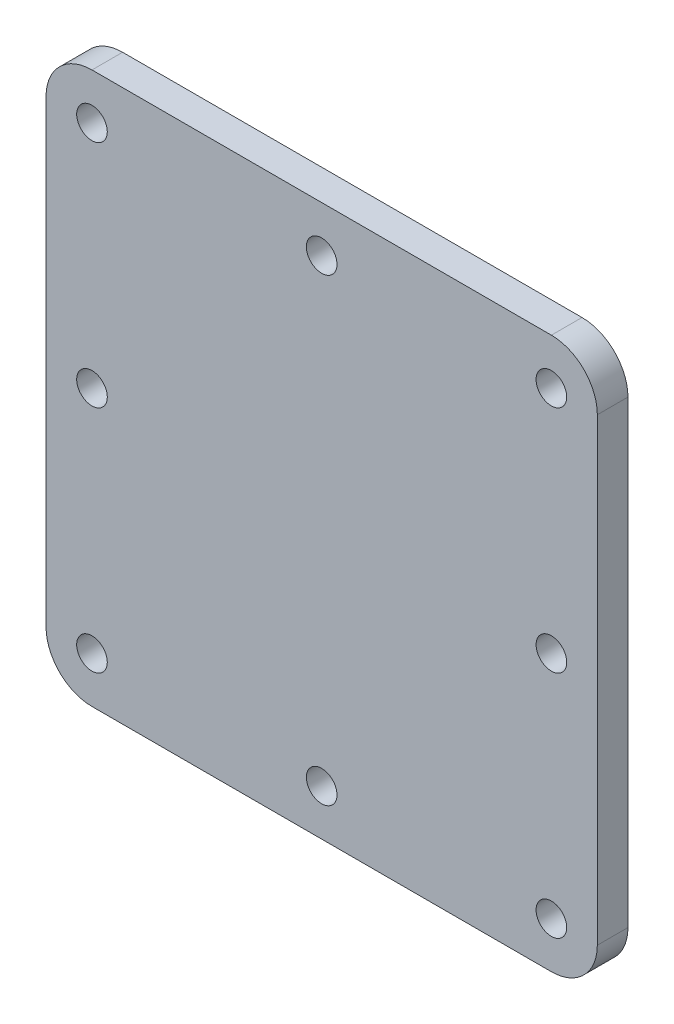
ISO-10303-21;
HEADER;
FILE_DESCRIPTION(('STEP AP214'),'2;1');
FILE_NAME('part.step','',(''),(''),'','','');
FILE_SCHEMA(('AUTOMOTIVE_DESIGN { 1 0 10303 214 1 1 1 1 }'));
ENDSEC;
DATA;
#1=APPLICATION_CONTEXT('core data for automotive mechanical design processes');
#2=APPLICATION_PROTOCOL_DEFINITION('international standard','automotive_design',2000,#1);
#3=PRODUCT_CONTEXT('',#1,'mechanical');
#4=PRODUCT('Part','Part','',(#3));
#5=PRODUCT_RELATED_PRODUCT_CATEGORY('part','',(#4));
#6=PRODUCT_DEFINITION_FORMATION('','',#4);
#7=PRODUCT_DEFINITION_CONTEXT('part definition',#1,'design');
#8=PRODUCT_DEFINITION('design','',#6,#7);
#9=PRODUCT_DEFINITION_SHAPE('','',#8);
#10=(LENGTH_UNIT() NAMED_UNIT(*) SI_UNIT(.MILLI.,.METRE.));
#11=(NAMED_UNIT(*) PLANE_ANGLE_UNIT() SI_UNIT($,.RADIAN.));
#12=(NAMED_UNIT(*) SI_UNIT($,.STERADIAN.) SOLID_ANGLE_UNIT());
#13=UNCERTAINTY_MEASURE_WITH_UNIT(LENGTH_MEASURE(1.E-05),#10,'distance_accuracy_value','');
#14=(GEOMETRIC_REPRESENTATION_CONTEXT(3) GLOBAL_UNCERTAINTY_ASSIGNED_CONTEXT((#13)) GLOBAL_UNIT_ASSIGNED_CONTEXT((#10,
#11,#12)) REPRESENTATION_CONTEXT('',''));
#15=CARTESIAN_POINT('',(0.,0.,0.));
#16=DIRECTION('',(0.,0.,1.));
#17=DIRECTION('',(1.,0.,0.));
#18=AXIS2_PLACEMENT_3D('',#15,#16,#17);
#19=CARTESIAN_POINT('',(-75.,-75.,10.));
#20=DIRECTION('',(0.,0.,1.));
#21=DIRECTION('',(1.,0.,0.));
#22=AXIS2_PLACEMENT_3D('',#19,#20,#21);
#23=PLANE('',#22);
#24=CARTESIAN_POINT('',(1.54341102686378E-12,-75.,10.));
#25=DIRECTION('',(0.,0.,1.));
#26=DIRECTION('',(1.,0.,0.));
#27=AXIS2_PLACEMENT_3D('',#24,#25,#26);
#28=CIRCLE('',#27,5.);
#29=CARTESIAN_POINT('',(5.00000000000154,-75.,10.));
#30=VERTEX_POINT('',#29);
#31=EDGE_CURVE('E212',#30,#30,#28,.T.);
#32=ORIENTED_EDGE('',*,*,#31,.F.);
#33=EDGE_LOOP('',(#32));
#34=FACE_BOUND('',#33,.T.);
#35=CARTESIAN_POINT('',(75.0000000000008,0.,10.));
#36=DIRECTION('',(0.,0.,1.));
#37=DIRECTION('',(1.,0.,0.));
#38=AXIS2_PLACEMENT_3D('',#35,#36,#37);
#39=CIRCLE('',#38,5.);
#40=CARTESIAN_POINT('',(80.0000000000008,0.,10.));
#41=VERTEX_POINT('',#40);
#42=EDGE_CURVE('E200',#41,#41,#39,.T.);
#43=ORIENTED_EDGE('',*,*,#42,.F.);
#44=EDGE_LOOP('',(#43));
#45=FACE_BOUND('',#44,.T.);
#46=CARTESIAN_POINT('',(75.,75.,10.));
#47=DIRECTION('',(0.,0.,1.));
#48=DIRECTION('',(1.,0.,0.));
#49=AXIS2_PLACEMENT_3D('',#46,#47,#48);
#50=CIRCLE('',#49,5.00000000000001);
#51=CARTESIAN_POINT('',(80.,75.,10.));
#52=VERTEX_POINT('',#51);
#53=EDGE_CURVE('E188',#52,#52,#50,.T.);
#54=ORIENTED_EDGE('',*,*,#53,.F.);
#55=EDGE_LOOP('',(#54));
#56=FACE_BOUND('',#55,.T.);
#57=CARTESIAN_POINT('',(-75.,75.,10.));
#58=DIRECTION('',(0.,0.,1.));
#59=DIRECTION('',(1.,0.,0.));
#60=AXIS2_PLACEMENT_3D('',#57,#58,#59);
#61=CIRCLE('',#60,5.00000000000001);
#62=CARTESIAN_POINT('',(-70.,75.,10.));
#63=VERTEX_POINT('',#62);
#64=EDGE_CURVE('E134',#63,#63,#61,.T.);
#65=ORIENTED_EDGE('',*,*,#64,.F.);
#66=EDGE_LOOP('',(#65));
#67=FACE_BOUND('',#66,.T.);
#68=CARTESIAN_POINT('',(-75.,-75.,10.));
#69=DIRECTION('',(0.,0.,1.));
#70=DIRECTION('',(1.,0.,0.));
#71=AXIS2_PLACEMENT_3D('',#68,#69,#70);
#72=CIRCLE('',#71,15.);
#73=CARTESIAN_POINT('',(-90.,-74.9999999999999,10.));
#74=VERTEX_POINT('',#73);
#75=CARTESIAN_POINT('',(-74.9999999999999,-90.,10.));
#76=VERTEX_POINT('',#75);
#77=EDGE_CURVE('E145',#74,#76,#72,.T.);
#78=ORIENTED_EDGE('',*,*,#77,.T.);
#79=DIRECTION('',(1.,0.,0.));
#80=VECTOR('',#79,1.);
#81=CARTESIAN_POINT('',(-74.9999999999999,-90.,10.));
#82=LINE('',#81,#80);
#83=CARTESIAN_POINT('',(75.,-89.9999999999992,10.));
#84=VERTEX_POINT('',#83);
#85=EDGE_CURVE('E93',#76,#84,#82,.T.);
#86=ORIENTED_EDGE('',*,*,#85,.T.);
#87=CARTESIAN_POINT('',(75.,-74.9999999999992,10.));
#88=DIRECTION('',(0.,0.,1.));
#89=DIRECTION('',(1.,0.,0.));
#90=AXIS2_PLACEMENT_3D('',#87,#88,#89);
#91=CIRCLE('',#90,15.);
#92=CARTESIAN_POINT('',(90.,-75.,10.));
#93=VERTEX_POINT('',#92);
#94=EDGE_CURVE('E160',#84,#93,#91,.T.);
#95=ORIENTED_EDGE('',*,*,#94,.T.);
#96=DIRECTION('',(0.,1.,0.));
#97=VECTOR('',#96,1.);
#98=CARTESIAN_POINT('',(90.,75.0000000000019,10.));
#99=LINE('',#98,#97);
#100=CARTESIAN_POINT('',(90.,75.0000000000019,10.));
#101=VERTEX_POINT('',#100);
#102=EDGE_CURVE('E173',#93,#101,#99,.T.);
#103=ORIENTED_EDGE('',*,*,#102,.T.);
#104=CARTESIAN_POINT('',(75.,75.,10.));
#105=DIRECTION('',(0.,0.,1.));
#106=DIRECTION('',(-1.,0.,0.));
#107=AXIS2_PLACEMENT_3D('',#104,#105,#106);
#108=CIRCLE('',#107,15.);
#109=CARTESIAN_POINT('',(74.9999999999999,90.,10.));
#110=VERTEX_POINT('',#109);
#111=EDGE_CURVE('E112',#101,#110,#108,.T.);
#112=ORIENTED_EDGE('',*,*,#111,.T.);
#113=DIRECTION('',(-1.,0.,0.));
#114=VECTOR('',#113,1.);
#115=CARTESIAN_POINT('',(-74.9999999999999,90.,10.));
#116=LINE('',#115,#114);
#117=CARTESIAN_POINT('',(-74.9999999999999,90.,10.));
#118=VERTEX_POINT('',#117);
#119=EDGE_CURVE('E106',#110,#118,#116,.T.);
#120=ORIENTED_EDGE('',*,*,#119,.T.);
#121=CARTESIAN_POINT('',(-75.,75.,10.));
#122=DIRECTION('',(0.,0.,1.));
#123=DIRECTION('',(1.,0.,0.));
#124=AXIS2_PLACEMENT_3D('',#121,#122,#123);
#125=CIRCLE('',#124,15.);
#126=CARTESIAN_POINT('',(-90.,74.9999999999999,10.));
#127=VERTEX_POINT('',#126);
#128=EDGE_CURVE('E110',#118,#127,#125,.T.);
#129=ORIENTED_EDGE('',*,*,#128,.T.);
#130=DIRECTION('',(0.,-1.,0.));
#131=VECTOR('',#130,1.);
#132=CARTESIAN_POINT('',(-90.,74.9999999999999,10.));
#133=LINE('',#132,#131);
#134=EDGE_CURVE('E50',#127,#74,#133,.T.);
#135=ORIENTED_EDGE('',*,*,#134,.T.);
#136=EDGE_LOOP('',(#78,#86,#95,#103,#112,#120,#129,#135));
#137=FACE_BOUND('',#136,.T.);
#138=CARTESIAN_POINT('',(0.,75.,10.));
#139=DIRECTION('',(0.,0.,1.));
#140=DIRECTION('',(1.,0.,0.));
#141=AXIS2_PLACEMENT_3D('',#138,#139,#140);
#142=CIRCLE('',#141,5.);
#143=CARTESIAN_POINT('',(4.99999999999997,75.,10.));
#144=VERTEX_POINT('',#143);
#145=EDGE_CURVE('E182',#144,#144,#142,.T.);
#146=ORIENTED_EDGE('',*,*,#145,.F.);
#147=EDGE_LOOP('',(#146));
#148=FACE_BOUND('',#147,.T.);
#149=CARTESIAN_POINT('',(-74.9999999999992,0.,10.));
#150=DIRECTION('',(0.,0.,1.));
#151=DIRECTION('',(1.,0.,0.));
#152=AXIS2_PLACEMENT_3D('',#149,#150,#151);
#153=CIRCLE('',#152,5.);
#154=CARTESIAN_POINT('',(-69.9999999999992,0.,10.));
#155=VERTEX_POINT('',#154);
#156=EDGE_CURVE('E194',#155,#155,#153,.T.);
#157=ORIENTED_EDGE('',*,*,#156,.F.);
#158=EDGE_LOOP('',(#157));
#159=FACE_BOUND('',#158,.T.);
#160=CARTESIAN_POINT('',(-74.9999999999985,-75.,10.));
#161=DIRECTION('',(0.,0.,1.));
#162=DIRECTION('',(1.,0.,0.));
#163=AXIS2_PLACEMENT_3D('',#160,#161,#162);
#164=CIRCLE('',#163,5.00000000000001);
#165=CARTESIAN_POINT('',(-69.9999999999985,-75.,10.));
#166=VERTEX_POINT('',#165);
#167=EDGE_CURVE('E206',#166,#166,#164,.T.);
#168=ORIENTED_EDGE('',*,*,#167,.F.);
#169=EDGE_LOOP('',(#168));
#170=FACE_BOUND('',#169,.T.);
#171=CARTESIAN_POINT('',(75.0000000000015,-75.,10.));
#172=DIRECTION('',(0.,0.,1.));
#173=DIRECTION('',(1.,0.,0.));
#174=AXIS2_PLACEMENT_3D('',#171,#172,#173);
#175=CIRCLE('',#174,5.00000000000001);
#176=CARTESIAN_POINT('',(80.0000000000015,-75.,10.));
#177=VERTEX_POINT('',#176);
#178=EDGE_CURVE('E218',#177,#177,#175,.T.);
#179=ORIENTED_EDGE('',*,*,#178,.F.);
#180=EDGE_LOOP('',(#179));
#181=FACE_BOUND('',#180,.T.);
#182=ADVANCED_FACE('F33',(#34,#45,#56,#67,#137,#148,#159,#170,#181),#23,.T.);
#183=CARTESIAN_POINT('',(-75.,-75.,0.));
#184=DIRECTION('',(0.,0.,1.));
#185=DIRECTION('',(1.,0.,0.));
#186=AXIS2_PLACEMENT_3D('',#183,#184,#185);
#187=PLANE('',#186);
#188=CARTESIAN_POINT('',(-75.,-75.,0.));
#189=DIRECTION('',(0.,0.,1.));
#190=DIRECTION('',(1.,0.,0.));
#191=AXIS2_PLACEMENT_3D('',#188,#189,#190);
#192=CIRCLE('',#191,15.);
#193=CARTESIAN_POINT('',(-90.,-74.9999999999999,0.));
#194=VERTEX_POINT('',#193);
#195=CARTESIAN_POINT('',(-74.9999999999999,-90.,0.));
#196=VERTEX_POINT('',#195);
#197=EDGE_CURVE('E130',#194,#196,#192,.T.);
#198=ORIENTED_EDGE('',*,*,#197,.F.);
#199=DIRECTION('',(0.,-1.,0.));
#200=VECTOR('',#199,1.);
#201=CARTESIAN_POINT('',(-90.,74.9999999999999,0.));
#202=LINE('',#201,#200);
#203=CARTESIAN_POINT('',(-90.,74.9999999999999,0.));
#204=VERTEX_POINT('',#203);
#205=EDGE_CURVE('E85',#204,#194,#202,.T.);
#206=ORIENTED_EDGE('',*,*,#205,.F.);
#207=CARTESIAN_POINT('',(-75.,75.,0.));
#208=DIRECTION('',(0.,0.,1.));
#209=DIRECTION('',(1.,0.,0.));
#210=AXIS2_PLACEMENT_3D('',#207,#208,#209);
#211=CIRCLE('',#210,15.);
#212=CARTESIAN_POINT('',(-74.9999999999999,90.,0.));
#213=VERTEX_POINT('',#212);
#214=EDGE_CURVE('E79',#213,#204,#211,.T.);
#215=ORIENTED_EDGE('',*,*,#214,.F.);
#216=DIRECTION('',(-1.,0.,0.));
#217=VECTOR('',#216,1.);
#218=CARTESIAN_POINT('',(-74.9999999999999,90.,0.));
#219=LINE('',#218,#217);
#220=CARTESIAN_POINT('',(74.9999999999999,90.,0.));
#221=VERTEX_POINT('',#220);
#222=EDGE_CURVE('E120',#221,#213,#219,.T.);
#223=ORIENTED_EDGE('',*,*,#222,.F.);
#224=CARTESIAN_POINT('',(75.,75.,0.));
#225=DIRECTION('',(0.,0.,1.));
#226=DIRECTION('',(-1.,0.,0.));
#227=AXIS2_PLACEMENT_3D('',#224,#225,#226);
#228=CIRCLE('',#227,15.);
#229=CARTESIAN_POINT('',(90.,75.0000000000019,0.));
#230=VERTEX_POINT('',#229);
#231=EDGE_CURVE('E140',#230,#221,#228,.T.);
#232=ORIENTED_EDGE('',*,*,#231,.F.);
#233=DIRECTION('',(0.,1.,0.));
#234=VECTOR('',#233,1.);
#235=CARTESIAN_POINT('',(90.,75.0000000000019,0.));
#236=LINE('',#235,#234);
#237=CARTESIAN_POINT('',(90.,-75.,0.));
#238=VERTEX_POINT('',#237);
#239=EDGE_CURVE('E138',#238,#230,#236,.T.);
#240=ORIENTED_EDGE('',*,*,#239,.F.);
#241=CARTESIAN_POINT('',(75.,-74.9999999999992,0.));
#242=DIRECTION('',(0.,0.,1.));
#243=DIRECTION('',(1.,0.,0.));
#244=AXIS2_PLACEMENT_3D('',#241,#242,#243);
#245=CIRCLE('',#244,15.);
#246=CARTESIAN_POINT('',(75.,-89.9999999999992,0.));
#247=VERTEX_POINT('',#246);
#248=EDGE_CURVE('E136',#247,#238,#245,.T.);
#249=ORIENTED_EDGE('',*,*,#248,.F.);
#250=DIRECTION('',(1.,0.,0.));
#251=VECTOR('',#250,1.);
#252=CARTESIAN_POINT('',(-74.9999999999999,-90.,0.));
#253=LINE('',#252,#251);
#254=EDGE_CURVE('E133',#196,#247,#253,.T.);
#255=ORIENTED_EDGE('',*,*,#254,.F.);
#256=EDGE_LOOP('',(#198,#206,#215,#223,#232,#240,#249,#255));
#257=FACE_BOUND('',#256,.T.);
#258=CARTESIAN_POINT('',(-75.,75.,0.));
#259=DIRECTION('',(0.,0.,1.));
#260=DIRECTION('',(1.,0.,0.));
#261=AXIS2_PLACEMENT_3D('',#258,#259,#260);
#262=CIRCLE('',#261,5.00000000000001);
#263=CARTESIAN_POINT('',(-70.,75.,0.));
#264=VERTEX_POINT('',#263);
#265=EDGE_CURVE('E179',#264,#264,#262,.T.);
#266=ORIENTED_EDGE('',*,*,#265,.T.);
#267=EDGE_LOOP('',(#266));
#268=FACE_BOUND('',#267,.T.);
#269=CARTESIAN_POINT('',(0.,75.,0.));
#270=DIRECTION('',(0.,0.,1.));
#271=DIRECTION('',(1.,0.,0.));
#272=AXIS2_PLACEMENT_3D('',#269,#270,#271);
#273=CIRCLE('',#272,5.);
#274=CARTESIAN_POINT('',(4.99999999999997,75.,0.));
#275=VERTEX_POINT('',#274);
#276=EDGE_CURVE('E185',#275,#275,#273,.T.);
#277=ORIENTED_EDGE('',*,*,#276,.T.);
#278=EDGE_LOOP('',(#277));
#279=FACE_BOUND('',#278,.T.);
#280=CARTESIAN_POINT('',(75.,75.,0.));
#281=DIRECTION('',(0.,0.,1.));
#282=DIRECTION('',(1.,0.,0.));
#283=AXIS2_PLACEMENT_3D('',#280,#281,#282);
#284=CIRCLE('',#283,5.00000000000001);
#285=CARTESIAN_POINT('',(80.,75.,0.));
#286=VERTEX_POINT('',#285);
#287=EDGE_CURVE('E191',#286,#286,#284,.T.);
#288=ORIENTED_EDGE('',*,*,#287,.T.);
#289=EDGE_LOOP('',(#288));
#290=FACE_BOUND('',#289,.T.);
#291=CARTESIAN_POINT('',(-74.9999999999992,0.,0.));
#292=DIRECTION('',(0.,0.,1.));
#293=DIRECTION('',(1.,0.,0.));
#294=AXIS2_PLACEMENT_3D('',#291,#292,#293);
#295=CIRCLE('',#294,5.);
#296=CARTESIAN_POINT('',(-69.9999999999992,0.,0.));
#297=VERTEX_POINT('',#296);
#298=EDGE_CURVE('E197',#297,#297,#295,.T.);
#299=ORIENTED_EDGE('',*,*,#298,.T.);
#300=EDGE_LOOP('',(#299));
#301=FACE_BOUND('',#300,.T.);
#302=CARTESIAN_POINT('',(75.0000000000008,0.,0.));
#303=DIRECTION('',(0.,0.,1.));
#304=DIRECTION('',(1.,0.,0.));
#305=AXIS2_PLACEMENT_3D('',#302,#303,#304);
#306=CIRCLE('',#305,5.);
#307=CARTESIAN_POINT('',(80.0000000000008,0.,0.));
#308=VERTEX_POINT('',#307);
#309=EDGE_CURVE('E203',#308,#308,#306,.T.);
#310=ORIENTED_EDGE('',*,*,#309,.T.);
#311=EDGE_LOOP('',(#310));
#312=FACE_BOUND('',#311,.T.);
#313=CARTESIAN_POINT('',(-74.9999999999985,-75.,0.));
#314=DIRECTION('',(0.,0.,1.));
#315=DIRECTION('',(1.,0.,0.));
#316=AXIS2_PLACEMENT_3D('',#313,#314,#315);
#317=CIRCLE('',#316,5.00000000000001);
#318=CARTESIAN_POINT('',(-69.9999999999985,-75.,0.));
#319=VERTEX_POINT('',#318);
#320=EDGE_CURVE('E209',#319,#319,#317,.T.);
#321=ORIENTED_EDGE('',*,*,#320,.T.);
#322=EDGE_LOOP('',(#321));
#323=FACE_BOUND('',#322,.T.);
#324=CARTESIAN_POINT('',(1.54341102686378E-12,-75.,0.));
#325=DIRECTION('',(0.,0.,1.));
#326=DIRECTION('',(1.,0.,0.));
#327=AXIS2_PLACEMENT_3D('',#324,#325,#326);
#328=CIRCLE('',#327,5.);
#329=CARTESIAN_POINT('',(5.00000000000154,-75.,0.));
#330=VERTEX_POINT('',#329);
#331=EDGE_CURVE('E215',#330,#330,#328,.T.);
#332=ORIENTED_EDGE('',*,*,#331,.T.);
#333=EDGE_LOOP('',(#332));
#334=FACE_BOUND('',#333,.T.);
#335=CARTESIAN_POINT('',(75.0000000000015,-75.,0.));
#336=DIRECTION('',(0.,0.,1.));
#337=DIRECTION('',(1.,0.,0.));
#338=AXIS2_PLACEMENT_3D('',#335,#336,#337);
#339=CIRCLE('',#338,5.00000000000001);
#340=CARTESIAN_POINT('',(80.0000000000015,-75.,0.));
#341=VERTEX_POINT('',#340);
#342=EDGE_CURVE('E221',#341,#341,#339,.T.);
#343=ORIENTED_EDGE('',*,*,#342,.T.);
#344=EDGE_LOOP('',(#343));
#345=FACE_BOUND('',#344,.T.);
#346=ADVANCED_FACE('F164',(#257,#268,#279,#290,#301,#312,#323,#334,#345),#187,.F.);
#347=CARTESIAN_POINT('',(-75.,-75.,10.));
#348=DIRECTION('',(0.,0.,-1.));
#349=DIRECTION('',(-1.,0.,0.));
#350=AXIS2_PLACEMENT_3D('',#347,#348,#349);
#351=CYLINDRICAL_SURFACE('',#350,15.);
#352=ORIENTED_EDGE('',*,*,#197,.T.);
#353=DIRECTION('',(0.,0.,-1.));
#354=VECTOR('',#353,1.);
#355=CARTESIAN_POINT('',(-74.9999999999999,-90.,10.));
#356=LINE('',#355,#354);
#357=EDGE_CURVE('E11',#76,#196,#356,.T.);
#358=ORIENTED_EDGE('',*,*,#357,.F.);
#359=ORIENTED_EDGE('',*,*,#77,.F.);
#360=DIRECTION('',(0.,0.,-1.));
#361=VECTOR('',#360,1.);
#362=CARTESIAN_POINT('',(-90.,-74.9999999999999,10.));
#363=LINE('',#362,#361);
#364=EDGE_CURVE('E126',#74,#194,#363,.T.);
#365=ORIENTED_EDGE('',*,*,#364,.T.);
#366=EDGE_LOOP('',(#352,#358,#359,#365));
#367=FACE_BOUND('',#366,.T.);
#368=ADVANCED_FACE('F35',(#367),#351,.T.);
#369=CARTESIAN_POINT('',(-74.9999999999999,-90.,10.));
#370=DIRECTION('',(0.,1.,0.));
#371=DIRECTION('',(-1.,0.,0.));
#372=AXIS2_PLACEMENT_3D('',#369,#370,#371);
#373=PLANE('',#372);
#374=ORIENTED_EDGE('',*,*,#254,.T.);
#375=DIRECTION('',(0.,0.,-1.));
#376=VECTOR('',#375,1.);
#377=CARTESIAN_POINT('',(75.,-89.9999999999992,10.));
#378=LINE('',#377,#376);
#379=EDGE_CURVE('E42',#84,#247,#378,.T.);
#380=ORIENTED_EDGE('',*,*,#379,.F.);
#381=ORIENTED_EDGE('',*,*,#85,.F.);
#382=ORIENTED_EDGE('',*,*,#357,.T.);
#383=EDGE_LOOP('',(#374,#380,#381,#382));
#384=FACE_BOUND('',#383,.T.);
#385=ADVANCED_FACE('F255',(#384),#373,.F.);
#386=CARTESIAN_POINT('',(75.,-74.9999999999992,10.));
#387=DIRECTION('',(0.,0.,-1.));
#388=DIRECTION('',(-1.,0.,0.));
#389=AXIS2_PLACEMENT_3D('',#386,#387,#388);
#390=CYLINDRICAL_SURFACE('',#389,15.);
#391=ORIENTED_EDGE('',*,*,#248,.T.);
#392=DIRECTION('',(0.,0.,-1.));
#393=VECTOR('',#392,1.);
#394=CARTESIAN_POINT('',(90.,-75.,10.));
#395=LINE('',#394,#393);
#396=EDGE_CURVE('E152',#93,#238,#395,.T.);
#397=ORIENTED_EDGE('',*,*,#396,.F.);
#398=ORIENTED_EDGE('',*,*,#94,.F.);
#399=ORIENTED_EDGE('',*,*,#379,.T.);
#400=EDGE_LOOP('',(#391,#397,#398,#399));
#401=FACE_BOUND('',#400,.T.);
#402=ADVANCED_FACE('F158',(#401),#390,.T.);
#403=CARTESIAN_POINT('',(90.,75.0000000000019,10.));
#404=DIRECTION('',(-1.,0.,0.));
#405=DIRECTION('',(0.,-1.,0.));
#406=AXIS2_PLACEMENT_3D('',#403,#404,#405);
#407=PLANE('',#406);
#408=ORIENTED_EDGE('',*,*,#239,.T.);
#409=DIRECTION('',(0.,0.,-1.));
#410=VECTOR('',#409,1.);
#411=CARTESIAN_POINT('',(90.,75.0000000000019,10.));
#412=LINE('',#411,#410);
#413=EDGE_CURVE('E149',#101,#230,#412,.T.);
#414=ORIENTED_EDGE('',*,*,#413,.F.);
#415=ORIENTED_EDGE('',*,*,#102,.F.);
#416=ORIENTED_EDGE('',*,*,#396,.T.);
#417=EDGE_LOOP('',(#408,#414,#415,#416));
#418=FACE_BOUND('',#417,.T.);
#419=ADVANCED_FACE('F169',(#418),#407,.F.);
#420=CARTESIAN_POINT('',(75.,75.,10.));
#421=DIRECTION('',(0.,0.,-1.));
#422=DIRECTION('',(-1.,0.,0.));
#423=AXIS2_PLACEMENT_3D('',#420,#421,#422);
#424=CYLINDRICAL_SURFACE('',#423,15.);
#425=ORIENTED_EDGE('',*,*,#231,.T.);
#426=DIRECTION('',(0.,0.,-1.));
#427=VECTOR('',#426,1.);
#428=CARTESIAN_POINT('',(74.9999999999999,90.,10.));
#429=LINE('',#428,#427);
#430=EDGE_CURVE('E121',#110,#221,#429,.T.);
#431=ORIENTED_EDGE('',*,*,#430,.F.);
#432=ORIENTED_EDGE('',*,*,#111,.F.);
#433=ORIENTED_EDGE('',*,*,#413,.T.);
#434=EDGE_LOOP('',(#425,#431,#432,#433));
#435=FACE_BOUND('',#434,.T.);
#436=ADVANCED_FACE('F172',(#435),#424,.T.);
#437=CARTESIAN_POINT('',(-74.9999999999999,90.,10.));
#438=DIRECTION('',(0.,-1.,0.));
#439=DIRECTION('',(0.,0.,-1.));
#440=AXIS2_PLACEMENT_3D('',#437,#438,#439);
#441=PLANE('',#440);
#442=ORIENTED_EDGE('',*,*,#222,.T.);
#443=DIRECTION('',(0.,0.,-1.));
#444=VECTOR('',#443,1.);
#445=CARTESIAN_POINT('',(-74.9999999999999,90.,10.));
#446=LINE('',#445,#444);
#447=EDGE_CURVE('E117',#118,#213,#446,.T.);
#448=ORIENTED_EDGE('',*,*,#447,.F.);
#449=ORIENTED_EDGE('',*,*,#119,.F.);
#450=ORIENTED_EDGE('',*,*,#430,.T.);
#451=EDGE_LOOP('',(#442,#448,#449,#450));
#452=FACE_BOUND('',#451,.T.);
#453=ADVANCED_FACE('F118',(#452),#441,.F.);
#454=CARTESIAN_POINT('',(-75.,75.,10.));
#455=DIRECTION('',(0.,0.,-1.));
#456=DIRECTION('',(-1.,0.,0.));
#457=AXIS2_PLACEMENT_3D('',#454,#455,#456);
#458=CYLINDRICAL_SURFACE('',#457,15.);
#459=ORIENTED_EDGE('',*,*,#214,.T.);
#460=DIRECTION('',(0.,0.,-1.));
#461=VECTOR('',#460,1.);
#462=CARTESIAN_POINT('',(-90.,74.9999999999999,10.));
#463=LINE('',#462,#461);
#464=EDGE_CURVE('E122',#127,#204,#463,.T.);
#465=ORIENTED_EDGE('',*,*,#464,.F.);
#466=ORIENTED_EDGE('',*,*,#128,.F.);
#467=ORIENTED_EDGE('',*,*,#447,.T.);
#468=EDGE_LOOP('',(#459,#465,#466,#467));
#469=FACE_BOUND('',#468,.T.);
#470=ADVANCED_FACE('F124',(#469),#458,.T.);
#471=CARTESIAN_POINT('',(-90.,74.9999999999999,10.));
#472=DIRECTION('',(1.,0.,0.));
#473=DIRECTION('',(0.,1.,0.));
#474=AXIS2_PLACEMENT_3D('',#471,#472,#473);
#475=PLANE('',#474);
#476=ORIENTED_EDGE('',*,*,#205,.T.);
#477=ORIENTED_EDGE('',*,*,#364,.F.);
#478=ORIENTED_EDGE('',*,*,#134,.F.);
#479=ORIENTED_EDGE('',*,*,#464,.T.);
#480=EDGE_LOOP('',(#476,#477,#478,#479));
#481=FACE_BOUND('',#480,.T.);
#482=ADVANCED_FACE('F243',(#481),#475,.F.);
#483=CARTESIAN_POINT('',(-75.,75.,10.));
#484=DIRECTION('',(0.,0.,-1.));
#485=DIRECTION('',(-1.,0.,0.));
#486=AXIS2_PLACEMENT_3D('',#483,#484,#485);
#487=CYLINDRICAL_SURFACE('',#486,5.00000000000001);
#488=ORIENTED_EDGE('',*,*,#64,.T.);
#489=EDGE_LOOP('',(#488));
#490=FACE_BOUND('',#489,.T.);
#491=ORIENTED_EDGE('',*,*,#265,.F.);
#492=EDGE_LOOP('',(#491));
#493=FACE_BOUND('',#492,.T.);
#494=ADVANCED_FACE('F240',(#490,#493),#487,.F.);
#495=CARTESIAN_POINT('',(0.,75.,10.));
#496=DIRECTION('',(0.,0.,-1.));
#497=DIRECTION('',(-1.,0.,0.));
#498=AXIS2_PLACEMENT_3D('',#495,#496,#497);
#499=CYLINDRICAL_SURFACE('',#498,5.);
#500=ORIENTED_EDGE('',*,*,#145,.T.);
#501=EDGE_LOOP('',(#500));
#502=FACE_BOUND('',#501,.T.);
#503=ORIENTED_EDGE('',*,*,#276,.F.);
#504=EDGE_LOOP('',(#503));
#505=FACE_BOUND('',#504,.T.);
#506=ADVANCED_FACE('F319',(#502,#505),#499,.F.);
#507=CARTESIAN_POINT('',(75.,75.,10.));
#508=DIRECTION('',(0.,0.,-1.));
#509=DIRECTION('',(-1.,0.,0.));
#510=AXIS2_PLACEMENT_3D('',#507,#508,#509);
#511=CYLINDRICAL_SURFACE('',#510,5.00000000000001);
#512=ORIENTED_EDGE('',*,*,#53,.T.);
#513=EDGE_LOOP('',(#512));
#514=FACE_BOUND('',#513,.T.);
#515=ORIENTED_EDGE('',*,*,#287,.F.);
#516=EDGE_LOOP('',(#515));
#517=FACE_BOUND('',#516,.T.);
#518=ADVANCED_FACE('F327',(#514,#517),#511,.F.);
#519=CARTESIAN_POINT('',(-74.9999999999992,0.,10.));
#520=DIRECTION('',(0.,0.,-1.));
#521=DIRECTION('',(-1.,0.,0.));
#522=AXIS2_PLACEMENT_3D('',#519,#520,#521);
#523=CYLINDRICAL_SURFACE('',#522,5.);
#524=ORIENTED_EDGE('',*,*,#156,.T.);
#525=EDGE_LOOP('',(#524));
#526=FACE_BOUND('',#525,.T.);
#527=ORIENTED_EDGE('',*,*,#298,.F.);
#528=EDGE_LOOP('',(#527));
#529=FACE_BOUND('',#528,.T.);
#530=ADVANCED_FACE('F335',(#526,#529),#523,.F.);
#531=CARTESIAN_POINT('',(75.0000000000008,0.,10.));
#532=DIRECTION('',(0.,0.,-1.));
#533=DIRECTION('',(-1.,0.,0.));
#534=AXIS2_PLACEMENT_3D('',#531,#532,#533);
#535=CYLINDRICAL_SURFACE('',#534,5.);
#536=ORIENTED_EDGE('',*,*,#42,.T.);
#537=EDGE_LOOP('',(#536));
#538=FACE_BOUND('',#537,.T.);
#539=ORIENTED_EDGE('',*,*,#309,.F.);
#540=EDGE_LOOP('',(#539));
#541=FACE_BOUND('',#540,.T.);
#542=ADVANCED_FACE('F344',(#538,#541),#535,.F.);
#543=CARTESIAN_POINT('',(-74.9999999999985,-75.,10.));
#544=DIRECTION('',(0.,0.,-1.));
#545=DIRECTION('',(-1.,0.,0.));
#546=AXIS2_PLACEMENT_3D('',#543,#544,#545);
#547=CYLINDRICAL_SURFACE('',#546,5.00000000000001);
#548=ORIENTED_EDGE('',*,*,#167,.T.);
#549=EDGE_LOOP('',(#548));
#550=FACE_BOUND('',#549,.T.);
#551=ORIENTED_EDGE('',*,*,#320,.F.);
#552=EDGE_LOOP('',(#551));
#553=FACE_BOUND('',#552,.T.);
#554=ADVANCED_FACE('F353',(#550,#553),#547,.F.);
#555=CARTESIAN_POINT('',(1.54341102686378E-12,-75.,10.));
#556=DIRECTION('',(0.,0.,-1.));
#557=DIRECTION('',(-1.,0.,0.));
#558=AXIS2_PLACEMENT_3D('',#555,#556,#557);
#559=CYLINDRICAL_SURFACE('',#558,5.);
#560=ORIENTED_EDGE('',*,*,#31,.T.);
#561=EDGE_LOOP('',(#560));
#562=FACE_BOUND('',#561,.T.);
#563=ORIENTED_EDGE('',*,*,#331,.F.);
#564=EDGE_LOOP('',(#563));
#565=FACE_BOUND('',#564,.T.);
#566=ADVANCED_FACE('F362',(#562,#565),#559,.F.);
#567=CARTESIAN_POINT('',(75.0000000000015,-75.,10.));
#568=DIRECTION('',(0.,0.,-1.));
#569=DIRECTION('',(-1.,0.,0.));
#570=AXIS2_PLACEMENT_3D('',#567,#568,#569);
#571=CYLINDRICAL_SURFACE('',#570,5.00000000000001);
#572=ORIENTED_EDGE('',*,*,#178,.T.);
#573=EDGE_LOOP('',(#572));
#574=FACE_BOUND('',#573,.T.);
#575=ORIENTED_EDGE('',*,*,#342,.F.);
#576=EDGE_LOOP('',(#575));
#577=FACE_BOUND('',#576,.T.);
#578=ADVANCED_FACE('F227',(#574,#577),#571,.F.);
#579=CLOSED_SHELL('',(#182,#346,#368,#385,#402,#419,#436,#453,#470,#482,#494,#506,#518,#530,
#542,#554,#566,#578));
#580=MANIFOLD_SOLID_BREP('B2',#579);
#581=ADVANCED_BREP_SHAPE_REPRESENTATION('',(#18,#580),#14);
#582=SHAPE_DEFINITION_REPRESENTATION(#9,#581);
ENDSEC;
END-ISO-10303-21;
